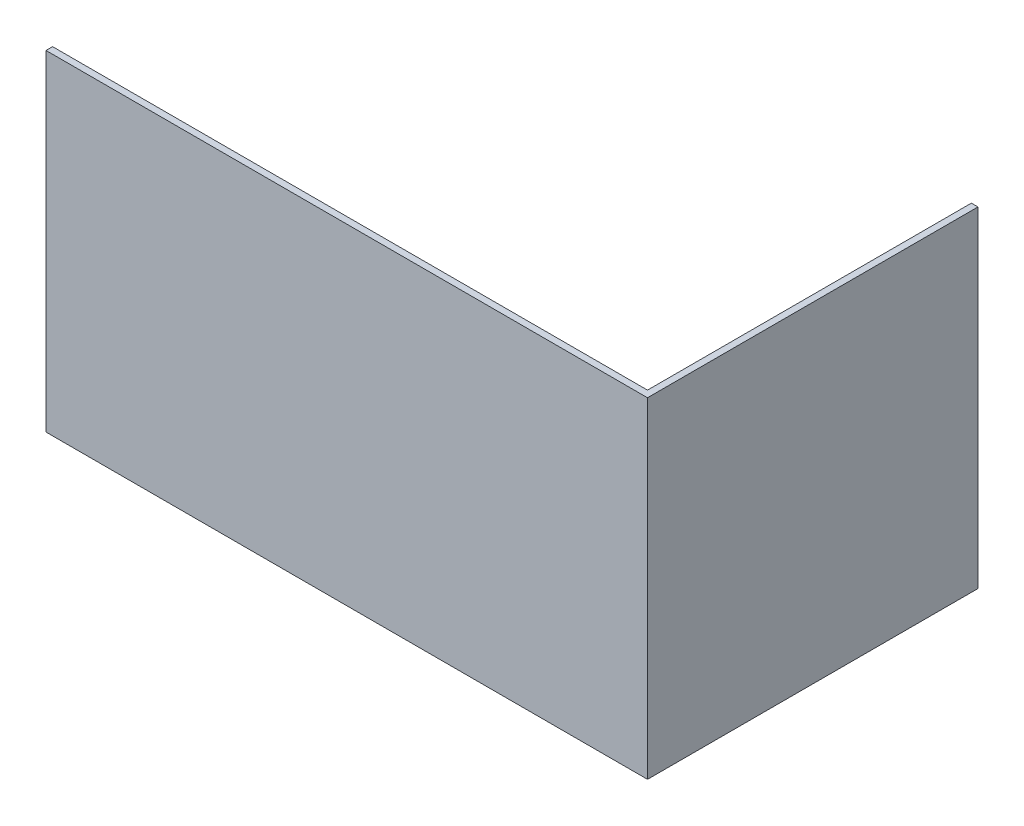
ISO-10303-21;
HEADER;
FILE_DESCRIPTION(('STEP AP214'),'2;1');
FILE_NAME('part.step','',(''),(''),'','','');
FILE_SCHEMA(('AUTOMOTIVE_DESIGN { 1 0 10303 214 1 1 1 1 }'));
ENDSEC;
DATA;
#1=APPLICATION_CONTEXT('core data for automotive mechanical design processes');
#2=APPLICATION_PROTOCOL_DEFINITION('international standard','automotive_design',2000,#1);
#3=PRODUCT_CONTEXT('',#1,'mechanical');
#4=PRODUCT('Part','Part','',(#3));
#5=PRODUCT_RELATED_PRODUCT_CATEGORY('part','',(#4));
#6=PRODUCT_DEFINITION_FORMATION('','',#4);
#7=PRODUCT_DEFINITION_CONTEXT('part definition',#1,'design');
#8=PRODUCT_DEFINITION('design','',#6,#7);
#9=PRODUCT_DEFINITION_SHAPE('','',#8);
#10=(LENGTH_UNIT() NAMED_UNIT(*) SI_UNIT(.MILLI.,.METRE.));
#11=(NAMED_UNIT(*) PLANE_ANGLE_UNIT() SI_UNIT($,.RADIAN.));
#12=(NAMED_UNIT(*) SI_UNIT($,.STERADIAN.) SOLID_ANGLE_UNIT());
#13=UNCERTAINTY_MEASURE_WITH_UNIT(LENGTH_MEASURE(1.E-05),#10,'distance_accuracy_value','');
#14=(GEOMETRIC_REPRESENTATION_CONTEXT(3) GLOBAL_UNCERTAINTY_ASSIGNED_CONTEXT((#13)) GLOBAL_UNIT_ASSIGNED_CONTEXT((#10,
#11,#12)) REPRESENTATION_CONTEXT('',''));
#15=CARTESIAN_POINT('',(0.,0.,0.));
#16=DIRECTION('',(0.,0.,1.));
#17=DIRECTION('',(1.,0.,0.));
#18=AXIS2_PLACEMENT_3D('',#15,#16,#17);
#19=CARTESIAN_POINT('',(1.13219664322772,21.1559737965681,-0.00549897200126439));
#20=CARTESIAN_POINT('',(1.13219664322772,21.1559737960436,0.000501027998735377));
#21=CARTESIAN_POINT('',(1.13219664322772,20.855973796568,-0.00549899822808457));
#22=CARTESIAN_POINT('',(1.13219664322772,20.8559737960435,0.000501001771915196));
#23=(BOUNDED_SURFACE() B_SPLINE_SURFACE(1,1,((#19,#20),(#21,#22)),.UNSPECIFIED.,.F.,.F.,
.F.) B_SPLINE_SURFACE_WITH_KNOTS((2,2),(2,2),(-2.50000000000106E-05,0.0002750000000001),
(-5.4999999999998E-06,4.99999999999993E-07),
.UNSPECIFIED.) GEOMETRIC_REPRESENTATION_ITEM() RATIONAL_B_SPLINE_SURFACE(((1.,1.),(1.,1.))) REPRESENTATION_ITEM('') SURFACE());
#24=CARTESIAN_POINT('',(1.13219664322772,20.8809737960872,1.00395748355367E-06));
#25=CARTESIAN_POINT('',(1.13219664322772,21.1309737960872,1.0258131670389E-06));
#26=(BOUNDED_CURVE() B_SPLINE_CURVE(1,(#24,#25),.UNSPECIFIED.,.F.,
.F.) B_SPLINE_CURVE_WITH_KNOTS((2,2),(0.,0.000250000000000004),
.UNSPECIFIED.) CURVE() GEOMETRIC_REPRESENTATION_ITEM() RATIONAL_B_SPLINE_CURVE((1.,1.)) REPRESENTATION_ITEM(''));
#27=CARTESIAN_POINT('',(1.13219664322772,20.8809737960872,1.00395748355367E-06));
#28=VERTEX_POINT('',#27);
#29=CARTESIAN_POINT('',(1.13219664322772,21.1309737960872,1.0258131670493E-06));
#30=VERTEX_POINT('',#29);
#31=EDGE_CURVE('E132',#28,#30,#26,.T.);
#32=CARTESIAN_POINT('',(1.13219664322772,21.1309737960872,1.0258131670493E-06));
#33=CARTESIAN_POINT('',(1.13219664322772,21.1309737965243,-0.00499897418683275));
#34=(BOUNDED_CURVE() B_SPLINE_CURVE(1,(#32,#33),.UNSPECIFIED.,.F.,
.F.) B_SPLINE_CURVE_WITH_KNOTS((2,2),(0.,4.9999999999998E-06),
.UNSPECIFIED.) CURVE() GEOMETRIC_REPRESENTATION_ITEM() RATIONAL_B_SPLINE_CURVE((1.,1.)) REPRESENTATION_ITEM(''));
#35=CARTESIAN_POINT('',(1.13219664322772,21.1309737965244,-0.00499897418683275));
#36=VERTEX_POINT('',#35);
#37=EDGE_CURVE('E31',#30,#36,#34,.T.);
#38=CARTESIAN_POINT('',(1.13219664322772,20.8809737965244,-0.00499899604251624));
#39=CARTESIAN_POINT('',(1.13219664322772,21.1309737965244,-0.00499897418683276));
#40=(BOUNDED_CURVE() B_SPLINE_CURVE(1,(#38,#39),.UNSPECIFIED.,.F.,
.F.) B_SPLINE_CURVE_WITH_KNOTS((2,2),(0.,0.00025),
.UNSPECIFIED.) CURVE() GEOMETRIC_REPRESENTATION_ITEM() RATIONAL_B_SPLINE_CURVE((1.,1.)) REPRESENTATION_ITEM(''));
#41=CARTESIAN_POINT('',(1.13219664322772,20.8809737965244,-0.00499899604251624));
#42=VERTEX_POINT('',#41);
#43=EDGE_CURVE('E195',#42,#36,#40,.T.);
#44=CARTESIAN_POINT('',(1.13219664322772,20.8809737960872,1.00395748355367E-06));
#45=CARTESIAN_POINT('',(1.13219664322772,20.8809737965243,-0.00499899604251624));
#46=(BOUNDED_CURVE() B_SPLINE_CURVE(1,(#44,#45),.UNSPECIFIED.,.F.,
.F.) B_SPLINE_CURVE_WITH_KNOTS((2,2),(0.,4.99999999999979E-06),
.UNSPECIFIED.) CURVE() GEOMETRIC_REPRESENTATION_ITEM() RATIONAL_B_SPLINE_CURVE((1.,1.)) REPRESENTATION_ITEM(''));
#47=EDGE_CURVE('E11',#28,#42,#46,.T.);
#48=ORIENTED_EDGE('',*,*,#31,.T.);
#49=ORIENTED_EDGE('',*,*,#37,.T.);
#50=ORIENTED_EDGE('',*,*,#43,.F.);
#51=ORIENTED_EDGE('',*,*,#47,.F.);
#52=EDGE_LOOP('',(#48,#49,#50,#51));
#53=FACE_BOUND('',#52,.T.);
#54=ADVANCED_FACE('F17',(#53),#23,.T.);
#55=CARTESIAN_POINT('',(1.08669664322772,20.8809738201285,-0.274998996042516));
#56=CARTESIAN_POINT('',(1.08669664322772,20.8809737939016,0.0250010039574835));
#57=CARTESIAN_POINT('',(1.63269664322773,20.8809738201285,-0.274998996042516));
#58=CARTESIAN_POINT('',(1.63269664322773,20.8809737939016,0.0250010039574835));
#59=(BOUNDED_SURFACE() B_SPLINE_SURFACE(1,1,((#55,#56),(#57,#58)),.UNSPECIFIED.,.F.,.F.,
.F.) B_SPLINE_SURFACE_WITH_KNOTS((2,2),(2,2),(-4.5500000000001E-05,0.000500500000000011),
(-0.000275,2.5E-05),
.UNSPECIFIED.) GEOMETRIC_REPRESENTATION_ITEM() RATIONAL_B_SPLINE_SURFACE(((1.,1.),(1.,1.))) REPRESENTATION_ITEM('') SURFACE());
#60=CARTESIAN_POINT('',(1.58219664322773,20.8809737965244,-0.00499899604251624));
#61=CARTESIAN_POINT('',(1.13219664322772,20.8809737965244,-0.00499899604251624));
#62=(BOUNDED_CURVE() B_SPLINE_CURVE(1,(#60,#61),.UNSPECIFIED.,.F.,
.F.) B_SPLINE_CURVE_WITH_KNOTS((2,2),(4.99999999999973E-06,0.00045500000000001),
.UNSPECIFIED.) CURVE() GEOMETRIC_REPRESENTATION_ITEM() RATIONAL_B_SPLINE_CURVE((1.,1.)) REPRESENTATION_ITEM(''));
#63=CARTESIAN_POINT('',(1.58219664322773,20.8809737965244,-0.00499899604251624));
#64=VERTEX_POINT('',#63);
#65=EDGE_CURVE('E182',#64,#42,#62,.T.);
#66=CARTESIAN_POINT('',(1.58219664322773,20.8809737965243,-0.00499899604251624));
#67=CARTESIAN_POINT('',(1.58219664322773,20.8809738179429,-0.249998996042516));
#68=(BOUNDED_CURVE() B_SPLINE_CURVE(1,(#66,#67),.UNSPECIFIED.,.F.,
.F.) B_SPLINE_CURVE_WITH_KNOTS((2,2),(4.99999999999979E-06,0.00025),
.UNSPECIFIED.) CURVE() GEOMETRIC_REPRESENTATION_ITEM() RATIONAL_B_SPLINE_CURVE((1.,1.)) REPRESENTATION_ITEM(''));
#69=CARTESIAN_POINT('',(1.58219664322773,20.8809738179429,-0.249998996042516));
#70=VERTEX_POINT('',#69);
#71=EDGE_CURVE('E89',#64,#70,#68,.T.);
#72=CARTESIAN_POINT('',(1.58219664322773,20.8809738179429,-0.249998996042516));
#73=CARTESIAN_POINT('',(1.58719664322773,20.8809738179429,-0.249998996042516));
#74=(BOUNDED_CURVE() B_SPLINE_CURVE(1,(#72,#73),.UNSPECIFIED.,.F.,
.F.) B_SPLINE_CURVE_WITH_KNOTS((2,2),(-4.99999999999973E-06,0.),
.UNSPECIFIED.) CURVE() GEOMETRIC_REPRESENTATION_ITEM() RATIONAL_B_SPLINE_CURVE((1.,1.)) REPRESENTATION_ITEM(''));
#75=CARTESIAN_POINT('',(1.58719664322773,20.8809738179429,-0.249998996042516));
#76=VERTEX_POINT('',#75);
#77=EDGE_CURVE('E99',#70,#76,#74,.T.);
#78=CARTESIAN_POINT('',(1.58719664322773,20.8809737960872,1.00395748355367E-06));
#79=CARTESIAN_POINT('',(1.58719664322773,20.8809738179429,-0.249998996042516));
#80=(BOUNDED_CURVE() B_SPLINE_CURVE(1,(#78,#79),.UNSPECIFIED.,.F.,
.F.) B_SPLINE_CURVE_WITH_KNOTS((2,2),(0.,0.00025),
.UNSPECIFIED.) CURVE() GEOMETRIC_REPRESENTATION_ITEM() RATIONAL_B_SPLINE_CURVE((1.,1.)) REPRESENTATION_ITEM(''));
#81=CARTESIAN_POINT('',(1.58719664322773,20.8809737960872,1.00395748355367E-06));
#82=VERTEX_POINT('',#81);
#83=EDGE_CURVE('E90',#82,#76,#80,.T.);
#84=CARTESIAN_POINT('',(1.58719664322773,20.8809737960872,1.00395748355367E-06));
#85=CARTESIAN_POINT('',(1.13219664322772,20.8809737960872,1.00395748355367E-06));
#86=(BOUNDED_CURVE() B_SPLINE_CURVE(1,(#84,#85),.UNSPECIFIED.,.F.,
.F.) B_SPLINE_CURVE_WITH_KNOTS((2,2),(0.,0.00045500000000001),
.UNSPECIFIED.) CURVE() GEOMETRIC_REPRESENTATION_ITEM() RATIONAL_B_SPLINE_CURVE((1.,1.)) REPRESENTATION_ITEM(''));
#87=EDGE_CURVE('E173',#82,#28,#86,.T.);
#88=ORIENTED_EDGE('',*,*,#47,.T.);
#89=ORIENTED_EDGE('',*,*,#65,.F.);
#90=ORIENTED_EDGE('',*,*,#71,.T.);
#91=ORIENTED_EDGE('',*,*,#77,.T.);
#92=ORIENTED_EDGE('',*,*,#83,.F.);
#93=ORIENTED_EDGE('',*,*,#87,.T.);
#94=EDGE_LOOP('',(#88,#89,#90,#91,#92,#93));
#95=FACE_BOUND('',#94,.T.);
#96=ADVANCED_FACE('F260',(#95),#59,.T.);
#97=CARTESIAN_POINT('',(1.63269664322773,21.1309738201285,-0.274998974186832));
#98=CARTESIAN_POINT('',(1.63269664322773,21.1309737939016,0.025001025813167));
#99=CARTESIAN_POINT('',(1.08669664322772,21.1309738201285,-0.274998974186832));
#100=CARTESIAN_POINT('',(1.08669664322772,21.1309737939016,0.025001025813167));
#101=(BOUNDED_SURFACE() B_SPLINE_SURFACE(1,1,((#97,#98),(#99,#100)),.UNSPECIFIED.,.F.,.F.,
.F.) B_SPLINE_SURFACE_WITH_KNOTS((2,2),(2,2),(-4.5500000000001E-05,0.000500500000000011),
(-0.000275,2.5E-05),
.UNSPECIFIED.) GEOMETRIC_REPRESENTATION_ITEM() RATIONAL_B_SPLINE_SURFACE(((1.,1.),(1.,1.))) REPRESENTATION_ITEM('') SURFACE());
#102=CARTESIAN_POINT('',(1.13219664322772,21.1309737960872,1.0258131670493E-06));
#103=CARTESIAN_POINT('',(1.58719664322773,21.1309737960872,1.0258131670493E-06));
#104=(BOUNDED_CURVE() B_SPLINE_CURVE(1,(#102,#103),.UNSPECIFIED.,.F.,
.F.) B_SPLINE_CURVE_WITH_KNOTS((2,2),(0.,0.00045500000000001),
.UNSPECIFIED.) CURVE() GEOMETRIC_REPRESENTATION_ITEM() RATIONAL_B_SPLINE_CURVE((1.,1.)) REPRESENTATION_ITEM(''));
#105=CARTESIAN_POINT('',(1.58719664322773,21.1309737960872,1.0258131670493E-06));
#106=VERTEX_POINT('',#105);
#107=EDGE_CURVE('E84',#30,#106,#104,.T.);
#108=CARTESIAN_POINT('',(1.58719664322773,21.1309737960872,1.0258131670493E-06));
#109=CARTESIAN_POINT('',(1.58719664322773,21.1309738179429,-0.249998974186832));
#110=(BOUNDED_CURVE() B_SPLINE_CURVE(1,(#108,#109),.UNSPECIFIED.,.F.,
.F.) B_SPLINE_CURVE_WITH_KNOTS((2,2),(0.,0.00025),
.UNSPECIFIED.) CURVE() GEOMETRIC_REPRESENTATION_ITEM() RATIONAL_B_SPLINE_CURVE((1.,1.)) REPRESENTATION_ITEM(''));
#111=CARTESIAN_POINT('',(1.58719664322773,21.1309738179429,-0.249998974186832));
#112=VERTEX_POINT('',#111);
#113=EDGE_CURVE('E22',#106,#112,#110,.T.);
#114=CARTESIAN_POINT('',(1.58219664322773,21.1309738179429,-0.249998974186832));
#115=CARTESIAN_POINT('',(1.58719664322773,21.1309738179429,-0.249998974186832));
#116=(BOUNDED_CURVE() B_SPLINE_CURVE(1,(#114,#115),.UNSPECIFIED.,.F.,
.F.) B_SPLINE_CURVE_WITH_KNOTS((2,2),(0.,4.99999999999973E-06),
.UNSPECIFIED.) CURVE() GEOMETRIC_REPRESENTATION_ITEM() RATIONAL_B_SPLINE_CURVE((1.,1.)) REPRESENTATION_ITEM(''));
#117=CARTESIAN_POINT('',(1.58219664322773,21.1309738179429,-0.249998974186832));
#118=VERTEX_POINT('',#117);
#119=EDGE_CURVE('E81',#118,#112,#116,.T.);
#120=CARTESIAN_POINT('',(1.58219664322773,21.1309738179429,-0.249998974186832));
#121=CARTESIAN_POINT('',(1.58219664322773,21.1309737965243,-0.00499897418683275));
#122=(BOUNDED_CURVE() B_SPLINE_CURVE(1,(#120,#121),.UNSPECIFIED.,.F.,
.F.) B_SPLINE_CURVE_WITH_KNOTS((2,2),(-0.00025,-4.9999999999998E-06),
.UNSPECIFIED.) CURVE() GEOMETRIC_REPRESENTATION_ITEM() RATIONAL_B_SPLINE_CURVE((1.,1.)) REPRESENTATION_ITEM(''));
#123=CARTESIAN_POINT('',(1.58219664322773,21.1309737965244,-0.00499897418683275));
#124=VERTEX_POINT('',#123);
#125=EDGE_CURVE('E202',#118,#124,#122,.T.);
#126=CARTESIAN_POINT('',(1.13219664322772,21.1309737965244,-0.00499897418683275));
#127=CARTESIAN_POINT('',(1.58219664322773,21.1309737965244,-0.00499897418683275));
#128=(BOUNDED_CURVE() B_SPLINE_CURVE(1,(#126,#127),.UNSPECIFIED.,.F.,
.F.) B_SPLINE_CURVE_WITH_KNOTS((2,2),(0.,0.00045000000000001),
.UNSPECIFIED.) CURVE() GEOMETRIC_REPRESENTATION_ITEM() RATIONAL_B_SPLINE_CURVE((1.,1.)) REPRESENTATION_ITEM(''));
#129=EDGE_CURVE('E65',#36,#124,#128,.T.);
#130=ORIENTED_EDGE('',*,*,#107,.T.);
#131=ORIENTED_EDGE('',*,*,#113,.T.);
#132=ORIENTED_EDGE('',*,*,#119,.F.);
#133=ORIENTED_EDGE('',*,*,#125,.T.);
#134=ORIENTED_EDGE('',*,*,#129,.F.);
#135=ORIENTED_EDGE('',*,*,#37,.F.);
#136=EDGE_LOOP('',(#130,#131,#132,#133,#134,#135));
#137=FACE_BOUND('',#136,.T.);
#138=ADVANCED_FACE('F79',(#137),#101,.T.);
#139=CARTESIAN_POINT('',(1.08669664322772,20.8559737960872,1.00177191520515E-06));
#140=CARTESIAN_POINT('',(1.08669664322772,21.1559737960872,1.02799873538742E-06));
#141=CARTESIAN_POINT('',(1.63269664322773,20.8559737960872,1.00177191520515E-06));
#142=CARTESIAN_POINT('',(1.63269664322773,21.1559737960872,1.02799873538742E-06));
#143=(BOUNDED_SURFACE() B_SPLINE_SURFACE(1,1,((#139,#140),(#141,#142)),.UNSPECIFIED.,.F.,.F.,
.F.) B_SPLINE_SURFACE_WITH_KNOTS((2,2),(2,2),(-0.000500500000000011,4.55000000000011E-05),
(-2.50000000000005E-05,0.000275000000000005),
.UNSPECIFIED.) GEOMETRIC_REPRESENTATION_ITEM() RATIONAL_B_SPLINE_SURFACE(((1.,1.),(1.,1.))) REPRESENTATION_ITEM('') SURFACE());
#144=CARTESIAN_POINT('',(1.58719664322773,21.1309737960872,1.0258131670493E-06));
#145=CARTESIAN_POINT('',(1.58719664322773,20.8809737960872,1.00395748356407E-06));
#146=(BOUNDED_CURVE() B_SPLINE_CURVE(1,(#144,#145),.UNSPECIFIED.,.F.,
.F.) B_SPLINE_CURVE_WITH_KNOTS((2,2),(0.,0.000250000000000004),
.UNSPECIFIED.) CURVE() GEOMETRIC_REPRESENTATION_ITEM() RATIONAL_B_SPLINE_CURVE((1.,1.)) REPRESENTATION_ITEM(''));
#147=EDGE_CURVE('E123',#106,#82,#146,.T.);
#148=ORIENTED_EDGE('',*,*,#87,.F.);
#149=ORIENTED_EDGE('',*,*,#147,.F.);
#150=ORIENTED_EDGE('',*,*,#107,.F.);
#151=ORIENTED_EDGE('',*,*,#31,.F.);
#152=EDGE_LOOP('',(#148,#149,#150,#151));
#153=FACE_BOUND('',#152,.T.);
#154=ADVANCED_FACE('F259',(#153),#143,.T.);
#155=CARTESIAN_POINT('',(1.62719664322773,20.8559737965244,-0.00499899822808459));
#156=CARTESIAN_POINT('',(1.62719664322773,21.1559737965244,-0.00499897200126441));
#157=CARTESIAN_POINT('',(1.08719664322772,20.8559737965244,-0.00499899822808459));
#158=CARTESIAN_POINT('',(1.08719664322772,21.1559737965244,-0.00499897200126441));
#159=(BOUNDED_SURFACE() B_SPLINE_SURFACE(1,1,((#155,#156),(#157,#158)),.UNSPECIFIED.,.F.,.F.,
.F.) B_SPLINE_SURFACE_WITH_KNOTS((2,2),(2,2),(-0.000500000000000011,4.00000000000014E-05),
(-2.5E-05,0.000275),
.UNSPECIFIED.) GEOMETRIC_REPRESENTATION_ITEM() RATIONAL_B_SPLINE_SURFACE(((1.,1.),(1.,1.))) REPRESENTATION_ITEM('') SURFACE());
#160=CARTESIAN_POINT('',(1.58219664322773,21.1309737965244,-0.00499897418683276));
#161=CARTESIAN_POINT('',(1.58219664322773,20.8809737965244,-0.00499899604251624));
#162=(BOUNDED_CURVE() B_SPLINE_CURVE(1,(#160,#161),.UNSPECIFIED.,.F.,
.F.) B_SPLINE_CURVE_WITH_KNOTS((2,2),(-0.00025,0.),
.UNSPECIFIED.) CURVE() GEOMETRIC_REPRESENTATION_ITEM() RATIONAL_B_SPLINE_CURVE((1.,1.)) REPRESENTATION_ITEM(''));
#163=EDGE_CURVE('E131',#124,#64,#162,.T.);
#164=ORIENTED_EDGE('',*,*,#43,.T.);
#165=ORIENTED_EDGE('',*,*,#129,.T.);
#166=ORIENTED_EDGE('',*,*,#163,.T.);
#167=ORIENTED_EDGE('',*,*,#65,.T.);
#168=EDGE_LOOP('',(#164,#165,#166,#167));
#169=FACE_BOUND('',#168,.T.);
#170=ADVANCED_FACE('F302',(#169),#159,.T.);
#171=CARTESIAN_POINT('',(1.58219664322773,20.8559738200847,-0.274498998228084));
#172=CARTESIAN_POINT('',(1.58219664322773,21.1559738200848,-0.274498972001264));
#173=CARTESIAN_POINT('',(1.58219664322773,20.8559737943824,0.0195010017719154));
#174=CARTESIAN_POINT('',(1.58219664322773,21.1559737943826,0.0195010279987356));
#175=(BOUNDED_SURFACE() B_SPLINE_SURFACE(1,1,((#171,#172),(#173,#174)),.UNSPECIFIED.,.F.,.F.,
.F.) B_SPLINE_SURFACE_WITH_KNOTS((2,2),(2,2),(-0.0002745,1.95000000000003E-05),
(-2.50000000000129E-05,0.0002750000000001),
.UNSPECIFIED.) GEOMETRIC_REPRESENTATION_ITEM() RATIONAL_B_SPLINE_SURFACE(((1.,1.),(1.,1.))) REPRESENTATION_ITEM('') SURFACE());
#176=CARTESIAN_POINT('',(1.58219664322773,20.8809738179429,-0.249998996042516));
#177=CARTESIAN_POINT('',(1.58219664322773,21.1309738179429,-0.249998974186833));
#178=(BOUNDED_CURVE() B_SPLINE_CURVE(1,(#176,#177),.UNSPECIFIED.,.F.,
.F.) B_SPLINE_CURVE_WITH_KNOTS((2,2),(0.,0.00025),
.UNSPECIFIED.) CURVE() GEOMETRIC_REPRESENTATION_ITEM() RATIONAL_B_SPLINE_CURVE((1.,1.)) REPRESENTATION_ITEM(''));
#179=EDGE_CURVE('E102',#70,#118,#178,.T.);
#180=ORIENTED_EDGE('',*,*,#71,.F.);
#181=ORIENTED_EDGE('',*,*,#163,.F.);
#182=ORIENTED_EDGE('',*,*,#125,.F.);
#183=ORIENTED_EDGE('',*,*,#179,.F.);
#184=EDGE_LOOP('',(#180,#181,#182,#183));
#185=FACE_BOUND('',#184,.T.);
#186=ADVANCED_FACE('F271',(#185),#175,.T.);
#187=CARTESIAN_POINT('',(1.58719664322773,20.8559738201284,-0.274998998228084));
#188=CARTESIAN_POINT('',(1.58719664322773,20.8559737939016,0.0250010017719152));
#189=CARTESIAN_POINT('',(1.58719664322773,21.1559738201285,-0.274998972001264));
#190=CARTESIAN_POINT('',(1.58719664322773,21.1559737939017,0.0250010279987354));
#191=(BOUNDED_SURFACE() B_SPLINE_SURFACE(1,1,((#187,#188),(#189,#190)),.UNSPECIFIED.,.F.,.F.,
.F.) B_SPLINE_SURFACE_WITH_KNOTS((2,2),(2,2),(-2.50000000000198E-05,0.00027500000000001),
(-0.000275,2.5E-05),
.UNSPECIFIED.) GEOMETRIC_REPRESENTATION_ITEM() RATIONAL_B_SPLINE_SURFACE(((1.,1.),(1.,1.))) REPRESENTATION_ITEM('') SURFACE());
#192=CARTESIAN_POINT('',(1.58719664322773,20.8809738179429,-0.249998996042516));
#193=CARTESIAN_POINT('',(1.58719664322773,21.1309738179429,-0.249998974186833));
#194=(BOUNDED_CURVE() B_SPLINE_CURVE(1,(#192,#193),.UNSPECIFIED.,.F.,
.F.) B_SPLINE_CURVE_WITH_KNOTS((2,2),(0.,0.00025),
.UNSPECIFIED.) CURVE() GEOMETRIC_REPRESENTATION_ITEM() RATIONAL_B_SPLINE_CURVE((1.,1.)) REPRESENTATION_ITEM(''));
#195=EDGE_CURVE('E92',#76,#112,#194,.T.);
#196=ORIENTED_EDGE('',*,*,#147,.T.);
#197=ORIENTED_EDGE('',*,*,#83,.T.);
#198=ORIENTED_EDGE('',*,*,#195,.T.);
#199=ORIENTED_EDGE('',*,*,#113,.F.);
#200=EDGE_LOOP('',(#196,#197,#198,#199));
#201=FACE_BOUND('',#200,.T.);
#202=ADVANCED_FACE('F93',(#201),#191,.T.);
#203=CARTESIAN_POINT('',(1.58769664322773,21.1559738179429,-0.249998972001264));
#204=CARTESIAN_POINT('',(1.58169664322773,21.1559738179429,-0.249998972001264));
#205=CARTESIAN_POINT('',(1.58769664322773,20.8559738179429,-0.249998998228084));
#206=CARTESIAN_POINT('',(1.58169664322773,20.8559738179429,-0.249998998228084));
#207=(BOUNDED_SURFACE() B_SPLINE_SURFACE(1,1,((#203,#204),(#205,#206)),.UNSPECIFIED.,.F.,.F.,
.F.) B_SPLINE_SURFACE_WITH_KNOTS((2,2),(2,2),(-2.50000000000004E-05,0.000275000000000004),
(-5.49999999999973E-06,4.99999999999976E-07),
.UNSPECIFIED.) GEOMETRIC_REPRESENTATION_ITEM() RATIONAL_B_SPLINE_SURFACE(((1.,1.),(1.,1.))) REPRESENTATION_ITEM('') SURFACE());
#208=ORIENTED_EDGE('',*,*,#179,.T.);
#209=ORIENTED_EDGE('',*,*,#119,.T.);
#210=ORIENTED_EDGE('',*,*,#195,.F.);
#211=ORIENTED_EDGE('',*,*,#77,.F.);
#212=EDGE_LOOP('',(#208,#209,#210,#211));
#213=FACE_BOUND('',#212,.T.);
#214=ADVANCED_FACE('F100',(#213),#207,.T.);
#215=CLOSED_SHELL('',(#54,#96,#138,#154,#170,#186,#202,#214));
#216=MANIFOLD_SOLID_BREP('B1',#215);
#217=ADVANCED_BREP_SHAPE_REPRESENTATION('',(#18,#216),#14);
#218=SHAPE_DEFINITION_REPRESENTATION(#9,#217);
ENDSEC;
END-ISO-10303-21;
